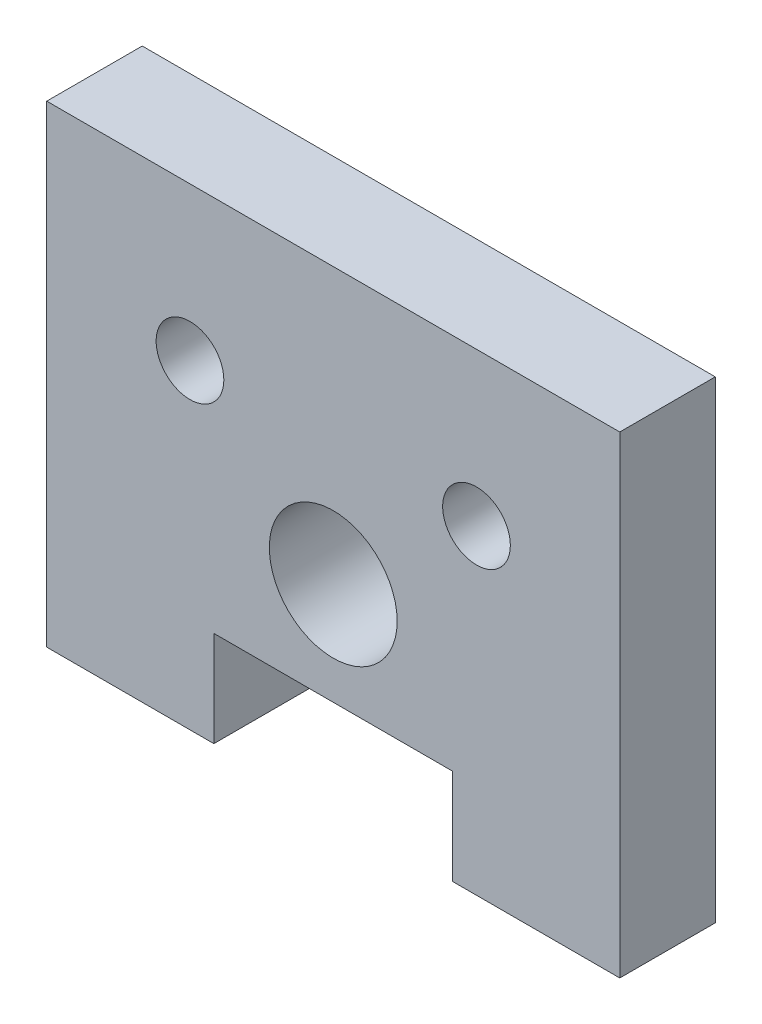
ISO-10303-21;
HEADER;
FILE_DESCRIPTION(('STEP AP214'),'2;1');
FILE_NAME('part.step','',(''),(''),'','','');
FILE_SCHEMA(('AUTOMOTIVE_DESIGN { 1 0 10303 214 1 1 1 1 }'));
ENDSEC;
DATA;
#1=APPLICATION_CONTEXT('core data for automotive mechanical design processes');
#2=APPLICATION_PROTOCOL_DEFINITION('international standard','automotive_design',2000,#1);
#3=PRODUCT_CONTEXT('',#1,'mechanical');
#4=PRODUCT('Part','Part','',(#3));
#5=PRODUCT_RELATED_PRODUCT_CATEGORY('part','',(#4));
#6=PRODUCT_DEFINITION_FORMATION('','',#4);
#7=PRODUCT_DEFINITION_CONTEXT('part definition',#1,'design');
#8=PRODUCT_DEFINITION('design','',#6,#7);
#9=PRODUCT_DEFINITION_SHAPE('','',#8);
#10=(LENGTH_UNIT() NAMED_UNIT(*) SI_UNIT(.MILLI.,.METRE.));
#11=(NAMED_UNIT(*) PLANE_ANGLE_UNIT() SI_UNIT($,.RADIAN.));
#12=(NAMED_UNIT(*) SI_UNIT($,.STERADIAN.) SOLID_ANGLE_UNIT());
#13=UNCERTAINTY_MEASURE_WITH_UNIT(LENGTH_MEASURE(1.E-05),#10,'distance_accuracy_value','');
#14=(GEOMETRIC_REPRESENTATION_CONTEXT(3) GLOBAL_UNCERTAINTY_ASSIGNED_CONTEXT((#13)) GLOBAL_UNIT_ASSIGNED_CONTEXT((#10,
#11,#12)) REPRESENTATION_CONTEXT('',''));
#15=CARTESIAN_POINT('',(0.,0.,0.));
#16=DIRECTION('',(0.,0.,1.));
#17=DIRECTION('',(1.,0.,0.));
#18=AXIS2_PLACEMENT_3D('',#15,#16,#17);
#19=CARTESIAN_POINT('',(-15.875,0.,12.7));
#20=DIRECTION('',(-1.,0.,0.));
#21=DIRECTION('',(0.,0.,1.));
#22=AXIS2_PLACEMENT_3D('',#19,#20,#21);
#23=PLANE('',#22);
#24=DIRECTION('',(0.,1.,0.));
#25=VECTOR('',#24,1.);
#26=CARTESIAN_POINT('',(-15.875,0.,0.));
#27=LINE('',#26,#25);
#28=CARTESIAN_POINT('',(-15.875,-34.544,0.));
#29=VERTEX_POINT('',#28);
#30=CARTESIAN_POINT('',(-15.875,-21.844,0.));
#31=VERTEX_POINT('',#30);
#32=EDGE_CURVE('E142',#29,#31,#27,.T.);
#33=ORIENTED_EDGE('',*,*,#32,.T.);
#34=DIRECTION('',(0.,0.,-1.));
#35=VECTOR('',#34,1.);
#36=CARTESIAN_POINT('',(-15.875,-21.844,12.7));
#37=LINE('',#36,#35);
#38=CARTESIAN_POINT('',(-15.875,-21.844,12.7));
#39=VERTEX_POINT('',#38);
#40=EDGE_CURVE('E11',#39,#31,#37,.T.);
#41=ORIENTED_EDGE('',*,*,#40,.F.);
#42=DIRECTION('',(0.,1.,0.));
#43=VECTOR('',#42,1.);
#44=CARTESIAN_POINT('',(-15.875,0.,12.7));
#45=LINE('',#44,#43);
#46=CARTESIAN_POINT('',(-15.875,-34.544,12.7));
#47=VERTEX_POINT('',#46);
#48=EDGE_CURVE('E187',#47,#39,#45,.T.);
#49=ORIENTED_EDGE('',*,*,#48,.F.);
#50=DIRECTION('',(0.,0.,-1.));
#51=VECTOR('',#50,1.);
#52=CARTESIAN_POINT('',(-15.875,-34.544,12.7));
#53=LINE('',#52,#51);
#54=EDGE_CURVE('E52',#47,#29,#53,.T.);
#55=ORIENTED_EDGE('',*,*,#54,.T.);
#56=EDGE_LOOP('',(#33,#41,#49,#55));
#57=FACE_BOUND('',#56,.T.);
#58=ADVANCED_FACE('F35',(#57),#23,.F.);
#59=CARTESIAN_POINT('',(0.,-21.844,12.7));
#60=DIRECTION('',(0.,1.,0.));
#61=DIRECTION('',(-1.,0.,0.));
#62=AXIS2_PLACEMENT_3D('',#59,#60,#61);
#63=PLANE('',#62);
#64=DIRECTION('',(1.,0.,0.));
#65=VECTOR('',#64,1.);
#66=CARTESIAN_POINT('',(0.,-21.844,0.));
#67=LINE('',#66,#65);
#68=CARTESIAN_POINT('',(15.875,-21.844,0.));
#69=VERTEX_POINT('',#68);
#70=EDGE_CURVE('E144',#31,#69,#67,.T.);
#71=ORIENTED_EDGE('',*,*,#70,.T.);
#72=DIRECTION('',(0.,0.,-1.));
#73=VECTOR('',#72,1.);
#74=CARTESIAN_POINT('',(15.875,-21.844,12.7));
#75=LINE('',#74,#73);
#76=CARTESIAN_POINT('',(15.875,-21.844,12.7));
#77=VERTEX_POINT('',#76);
#78=EDGE_CURVE('E44',#77,#69,#75,.T.);
#79=ORIENTED_EDGE('',*,*,#78,.F.);
#80=DIRECTION('',(1.,0.,0.));
#81=VECTOR('',#80,1.);
#82=CARTESIAN_POINT('',(0.,-21.844,12.7));
#83=LINE('',#82,#81);
#84=EDGE_CURVE('E90',#39,#77,#83,.T.);
#85=ORIENTED_EDGE('',*,*,#84,.F.);
#86=ORIENTED_EDGE('',*,*,#40,.T.);
#87=EDGE_LOOP('',(#71,#79,#85,#86));
#88=FACE_BOUND('',#87,.T.);
#89=ADVANCED_FACE('F223',(#88),#63,.F.);
#90=CARTESIAN_POINT('',(15.875,0.,12.7));
#91=DIRECTION('',(1.,0.,0.));
#92=DIRECTION('',(0.,0.,-1.));
#93=AXIS2_PLACEMENT_3D('',#90,#91,#92);
#94=PLANE('',#93);
#95=DIRECTION('',(0.,-1.,0.));
#96=VECTOR('',#95,1.);
#97=CARTESIAN_POINT('',(15.875,0.,0.));
#98=LINE('',#97,#96);
#99=CARTESIAN_POINT('',(15.875,-34.544,0.));
#100=VERTEX_POINT('',#99);
#101=EDGE_CURVE('E146',#69,#100,#98,.T.);
#102=ORIENTED_EDGE('',*,*,#101,.T.);
#103=DIRECTION('',(0.,0.,-1.));
#104=VECTOR('',#103,1.);
#105=CARTESIAN_POINT('',(15.875,-34.544,12.7));
#106=LINE('',#105,#104);
#107=CARTESIAN_POINT('',(15.875,-34.544,12.7));
#108=VERTEX_POINT('',#107);
#109=EDGE_CURVE('E167',#108,#100,#106,.T.);
#110=ORIENTED_EDGE('',*,*,#109,.F.);
#111=DIRECTION('',(0.,-1.,0.));
#112=VECTOR('',#111,1.);
#113=CARTESIAN_POINT('',(15.875,0.,12.7));
#114=LINE('',#113,#112);
#115=EDGE_CURVE('E174',#77,#108,#114,.T.);
#116=ORIENTED_EDGE('',*,*,#115,.F.);
#117=ORIENTED_EDGE('',*,*,#78,.T.);
#118=EDGE_LOOP('',(#102,#110,#116,#117));
#119=FACE_BOUND('',#118,.T.);
#120=ADVANCED_FACE('F172',(#119),#94,.F.);
#121=CARTESIAN_POINT('',(0.,-34.544,12.7));
#122=DIRECTION('',(0.,-1.,0.));
#123=DIRECTION('',(0.,0.,-1.));
#124=AXIS2_PLACEMENT_3D('',#121,#122,#123);
#125=PLANE('',#124);
#126=DIRECTION('',(-1.,0.,0.));
#127=VECTOR('',#126,1.);
#128=CARTESIAN_POINT('',(0.,-34.544,0.));
#129=LINE('',#128,#127);
#130=CARTESIAN_POINT('',(38.1,-34.544,0.));
#131=VERTEX_POINT('',#130);
#132=EDGE_CURVE('E149',#131,#100,#129,.T.);
#133=ORIENTED_EDGE('',*,*,#132,.F.);
#134=DIRECTION('',(0.,0.,-1.));
#135=VECTOR('',#134,1.);
#136=CARTESIAN_POINT('',(38.1,-34.544,12.7));
#137=LINE('',#136,#135);
#138=CARTESIAN_POINT('',(38.1,-34.544,12.7));
#139=VERTEX_POINT('',#138);
#140=EDGE_CURVE('E165',#139,#131,#137,.T.);
#141=ORIENTED_EDGE('',*,*,#140,.F.);
#142=DIRECTION('',(-1.,0.,0.));
#143=VECTOR('',#142,1.);
#144=CARTESIAN_POINT('',(0.,-34.544,12.7));
#145=LINE('',#144,#143);
#146=EDGE_CURVE('E182',#139,#108,#145,.T.);
#147=ORIENTED_EDGE('',*,*,#146,.T.);
#148=ORIENTED_EDGE('',*,*,#109,.T.);
#149=EDGE_LOOP('',(#133,#141,#147,#148));
#150=FACE_BOUND('',#149,.T.);
#151=ADVANCED_FACE('F180',(#150),#125,.T.);
#152=CARTESIAN_POINT('',(38.1,0.,12.7));
#153=DIRECTION('',(-1.,0.,0.));
#154=DIRECTION('',(0.,0.,1.));
#155=AXIS2_PLACEMENT_3D('',#152,#153,#154);
#156=PLANE('',#155);
#157=DIRECTION('',(0.,1.,0.));
#158=VECTOR('',#157,1.);
#159=CARTESIAN_POINT('',(38.1,0.,0.));
#160=LINE('',#159,#158);
#161=CARTESIAN_POINT('',(38.1,28.3363680824292,0.));
#162=VERTEX_POINT('',#161);
#163=EDGE_CURVE('E152',#131,#162,#160,.T.);
#164=ORIENTED_EDGE('',*,*,#163,.T.);
#165=DIRECTION('',(0.,0.,-1.));
#166=VECTOR('',#165,1.);
#167=CARTESIAN_POINT('',(38.1,28.3363680824292,12.7));
#168=LINE('',#167,#166);
#169=CARTESIAN_POINT('',(38.1,28.3363680824292,12.7));
#170=VERTEX_POINT('',#169);
#171=EDGE_CURVE('E115',#170,#162,#168,.T.);
#172=ORIENTED_EDGE('',*,*,#171,.F.);
#173=DIRECTION('',(0.,1.,0.));
#174=VECTOR('',#173,1.);
#175=CARTESIAN_POINT('',(38.1,0.,12.7));
#176=LINE('',#175,#174);
#177=EDGE_CURVE('E124',#139,#170,#176,.T.);
#178=ORIENTED_EDGE('',*,*,#177,.F.);
#179=ORIENTED_EDGE('',*,*,#140,.T.);
#180=EDGE_LOOP('',(#164,#172,#178,#179));
#181=FACE_BOUND('',#180,.T.);
#182=ADVANCED_FACE('F247',(#181),#156,.F.);
#183=CARTESIAN_POINT('',(0.,28.3363680824292,12.7));
#184=DIRECTION('',(0.,1.,0.));
#185=DIRECTION('',(-1.,0.,0.));
#186=AXIS2_PLACEMENT_3D('',#183,#184,#185);
#187=PLANE('',#186);
#188=DIRECTION('',(1.,0.,0.));
#189=VECTOR('',#188,1.);
#190=CARTESIAN_POINT('',(0.,28.3363680824292,0.));
#191=LINE('',#190,#189);
#192=CARTESIAN_POINT('',(-38.1,28.3363680824292,0.));
#193=VERTEX_POINT('',#192);
#194=EDGE_CURVE('E111',#193,#162,#191,.T.);
#195=ORIENTED_EDGE('',*,*,#194,.F.);
#196=DIRECTION('',(0.,0.,-1.));
#197=VECTOR('',#196,1.);
#198=CARTESIAN_POINT('',(-38.1,28.3363680824292,12.7));
#199=LINE('',#198,#197);
#200=CARTESIAN_POINT('',(-38.1,28.3363680824292,12.7));
#201=VERTEX_POINT('',#200);
#202=EDGE_CURVE('E106',#201,#193,#199,.T.);
#203=ORIENTED_EDGE('',*,*,#202,.F.);
#204=DIRECTION('',(1.,0.,0.));
#205=VECTOR('',#204,1.);
#206=CARTESIAN_POINT('',(0.,28.3363680824292,12.7));
#207=LINE('',#206,#205);
#208=EDGE_CURVE('E109',#201,#170,#207,.T.);
#209=ORIENTED_EDGE('',*,*,#208,.T.);
#210=ORIENTED_EDGE('',*,*,#171,.T.);
#211=EDGE_LOOP('',(#195,#203,#209,#210));
#212=FACE_BOUND('',#211,.T.);
#213=ADVANCED_FACE('F108',(#212),#187,.T.);
#214=CARTESIAN_POINT('',(-38.1,0.,12.7));
#215=DIRECTION('',(-1.,0.,0.));
#216=DIRECTION('',(0.,0.,1.));
#217=AXIS2_PLACEMENT_3D('',#214,#215,#216);
#218=PLANE('',#217);
#219=DIRECTION('',(0.,1.,0.));
#220=VECTOR('',#219,1.);
#221=CARTESIAN_POINT('',(-38.1,0.,0.));
#222=LINE('',#221,#220);
#223=CARTESIAN_POINT('',(-38.1,-34.544,0.));
#224=VERTEX_POINT('',#223);
#225=EDGE_CURVE('E156',#224,#193,#222,.T.);
#226=ORIENTED_EDGE('',*,*,#225,.F.);
#227=DIRECTION('',(0.,0.,-1.));
#228=VECTOR('',#227,1.);
#229=CARTESIAN_POINT('',(-38.1,-34.544,12.7));
#230=LINE('',#229,#228);
#231=CARTESIAN_POINT('',(-38.1,-34.544,12.7));
#232=VERTEX_POINT('',#231);
#233=EDGE_CURVE('E78',#232,#224,#230,.T.);
#234=ORIENTED_EDGE('',*,*,#233,.F.);
#235=DIRECTION('',(0.,1.,0.));
#236=VECTOR('',#235,1.);
#237=CARTESIAN_POINT('',(-38.1,0.,12.7));
#238=LINE('',#237,#236);
#239=EDGE_CURVE('E121',#232,#201,#238,.T.);
#240=ORIENTED_EDGE('',*,*,#239,.T.);
#241=ORIENTED_EDGE('',*,*,#202,.T.);
#242=EDGE_LOOP('',(#226,#234,#240,#241));
#243=FACE_BOUND('',#242,.T.);
#244=ADVANCED_FACE('F127',(#243),#218,.T.);
#245=CARTESIAN_POINT('',(-19.05,7.99200000000001,12.7));
#246=DIRECTION('',(0.,0.,-1.));
#247=DIRECTION('',(-1.,0.,0.));
#248=AXIS2_PLACEMENT_3D('',#245,#246,#247);
#249=CYLINDRICAL_SURFACE('',#248,4.5);
#250=CARTESIAN_POINT('',(-19.05,7.99200000000001,12.7));
#251=DIRECTION('',(0.,0.,1.));
#252=DIRECTION('',(1.,0.,0.));
#253=AXIS2_PLACEMENT_3D('',#250,#251,#252);
#254=CIRCLE('',#253,4.5);
#255=CARTESIAN_POINT('',(-14.55,7.99200000000001,12.7));
#256=VERTEX_POINT('',#255);
#257=EDGE_CURVE('E189',#256,#256,#254,.T.);
#258=ORIENTED_EDGE('',*,*,#257,.T.);
#259=EDGE_LOOP('',(#258));
#260=FACE_BOUND('',#259,.T.);
#261=CARTESIAN_POINT('',(-19.05,7.99200000000001,0.));
#262=DIRECTION('',(0.,0.,1.));
#263=DIRECTION('',(1.,0.,0.));
#264=AXIS2_PLACEMENT_3D('',#261,#262,#263);
#265=CIRCLE('',#264,4.5);
#266=CARTESIAN_POINT('',(-14.55,7.99200000000001,0.));
#267=VERTEX_POINT('',#266);
#268=EDGE_CURVE('E139',#267,#267,#265,.T.);
#269=ORIENTED_EDGE('',*,*,#268,.F.);
#270=EDGE_LOOP('',(#269));
#271=FACE_BOUND('',#270,.T.);
#272=ADVANCED_FACE('F208',(#260,#271),#249,.F.);
#273=CARTESIAN_POINT('',(19.05,7.99200000000001,12.7));
#274=DIRECTION('',(0.,0.,-1.));
#275=DIRECTION('',(-1.,0.,0.));
#276=AXIS2_PLACEMENT_3D('',#273,#274,#275);
#277=CYLINDRICAL_SURFACE('',#276,4.5);
#278=CARTESIAN_POINT('',(19.05,7.99200000000001,12.7));
#279=DIRECTION('',(0.,0.,1.));
#280=DIRECTION('',(1.,0.,0.));
#281=AXIS2_PLACEMENT_3D('',#278,#279,#280);
#282=CIRCLE('',#281,4.5);
#283=CARTESIAN_POINT('',(23.55,7.99200000000001,12.7));
#284=VERTEX_POINT('',#283);
#285=EDGE_CURVE('E192',#284,#284,#282,.T.);
#286=ORIENTED_EDGE('',*,*,#285,.T.);
#287=EDGE_LOOP('',(#286));
#288=FACE_BOUND('',#287,.T.);
#289=CARTESIAN_POINT('',(19.05,7.99200000000001,0.));
#290=DIRECTION('',(0.,0.,1.));
#291=DIRECTION('',(1.,0.,0.));
#292=AXIS2_PLACEMENT_3D('',#289,#290,#291);
#293=CIRCLE('',#292,4.5);
#294=CARTESIAN_POINT('',(23.55,7.99200000000001,0.));
#295=VERTEX_POINT('',#294);
#296=EDGE_CURVE('E136',#295,#295,#293,.T.);
#297=ORIENTED_EDGE('',*,*,#296,.F.);
#298=EDGE_LOOP('',(#297));
#299=FACE_BOUND('',#298,.T.);
#300=ADVANCED_FACE('F211',(#288,#299),#277,.F.);
#301=CARTESIAN_POINT('',(0.,-8.26399999999999,12.7));
#302=DIRECTION('',(0.,0.,-1.));
#303=DIRECTION('',(-1.,0.,0.));
#304=AXIS2_PLACEMENT_3D('',#301,#302,#303);
#305=CYLINDRICAL_SURFACE('',#304,8.5);
#306=CARTESIAN_POINT('',(0.,-8.26399999999999,12.7));
#307=DIRECTION('',(0.,0.,1.));
#308=DIRECTION('',(1.,0.,0.));
#309=AXIS2_PLACEMENT_3D('',#306,#307,#308);
#310=CIRCLE('',#309,8.5);
#311=CARTESIAN_POINT('',(8.5,-8.26399999999999,12.7));
#312=VERTEX_POINT('',#311);
#313=EDGE_CURVE('E161',#312,#312,#310,.T.);
#314=ORIENTED_EDGE('',*,*,#313,.T.);
#315=EDGE_LOOP('',(#314));
#316=FACE_BOUND('',#315,.T.);
#317=CARTESIAN_POINT('',(0.,-8.26399999999999,0.));
#318=DIRECTION('',(0.,0.,1.));
#319=DIRECTION('',(1.,0.,0.));
#320=AXIS2_PLACEMENT_3D('',#317,#318,#319);
#321=CIRCLE('',#320,8.5);
#322=CARTESIAN_POINT('',(8.5,-8.26399999999999,0.));
#323=VERTEX_POINT('',#322);
#324=EDGE_CURVE('E133',#323,#323,#321,.T.);
#325=ORIENTED_EDGE('',*,*,#324,.F.);
#326=EDGE_LOOP('',(#325));
#327=FACE_BOUND('',#326,.T.);
#328=ADVANCED_FACE('F37',(#316,#327),#305,.F.);
#329=CARTESIAN_POINT('',(0.,-34.544,12.7));
#330=DIRECTION('',(0.,-1.,0.));
#331=DIRECTION('',(0.,0.,-1.));
#332=AXIS2_PLACEMENT_3D('',#329,#330,#331);
#333=PLANE('',#332);
#334=DIRECTION('',(-1.,0.,0.));
#335=VECTOR('',#334,1.);
#336=CARTESIAN_POINT('',(0.,-34.544,0.));
#337=LINE('',#336,#335);
#338=EDGE_CURVE('E158',#29,#224,#337,.T.);
#339=ORIENTED_EDGE('',*,*,#338,.F.);
#340=ORIENTED_EDGE('',*,*,#54,.F.);
#341=DIRECTION('',(-1.,0.,0.));
#342=VECTOR('',#341,1.);
#343=CARTESIAN_POINT('',(0.,-34.544,12.7));
#344=LINE('',#343,#342);
#345=EDGE_CURVE('E128',#47,#232,#344,.T.);
#346=ORIENTED_EDGE('',*,*,#345,.T.);
#347=ORIENTED_EDGE('',*,*,#233,.T.);
#348=EDGE_LOOP('',(#339,#340,#346,#347));
#349=FACE_BOUND('',#348,.T.);
#350=ADVANCED_FACE('F202',(#349),#333,.T.);
#351=CARTESIAN_POINT('',(0.,0.,12.7));
#352=DIRECTION('',(0.,0.,1.));
#353=DIRECTION('',(1.,0.,0.));
#354=AXIS2_PLACEMENT_3D('',#351,#352,#353);
#355=PLANE('',#354);
#356=ORIENTED_EDGE('',*,*,#313,.F.);
#357=EDGE_LOOP('',(#356));
#358=FACE_BOUND('',#357,.T.);
#359=ORIENTED_EDGE('',*,*,#285,.F.);
#360=EDGE_LOOP('',(#359));
#361=FACE_BOUND('',#360,.T.);
#362=ORIENTED_EDGE('',*,*,#257,.F.);
#363=EDGE_LOOP('',(#362));
#364=FACE_BOUND('',#363,.T.);
#365=ORIENTED_EDGE('',*,*,#48,.T.);
#366=ORIENTED_EDGE('',*,*,#84,.T.);
#367=ORIENTED_EDGE('',*,*,#115,.T.);
#368=ORIENTED_EDGE('',*,*,#146,.F.);
#369=ORIENTED_EDGE('',*,*,#177,.T.);
#370=ORIENTED_EDGE('',*,*,#208,.F.);
#371=ORIENTED_EDGE('',*,*,#239,.F.);
#372=ORIENTED_EDGE('',*,*,#345,.F.);
#373=EDGE_LOOP('',(#365,#366,#367,#368,#369,#370,#371,#372));
#374=FACE_BOUND('',#373,.T.);
#375=ADVANCED_FACE('F119',(#358,#361,#364,#374),#355,.T.);
#376=CARTESIAN_POINT('',(0.,0.,0.));
#377=DIRECTION('',(0.,0.,1.));
#378=DIRECTION('',(1.,0.,0.));
#379=AXIS2_PLACEMENT_3D('',#376,#377,#378);
#380=PLANE('',#379);
#381=ORIENTED_EDGE('',*,*,#324,.T.);
#382=EDGE_LOOP('',(#381));
#383=FACE_BOUND('',#382,.T.);
#384=ORIENTED_EDGE('',*,*,#296,.T.);
#385=EDGE_LOOP('',(#384));
#386=FACE_BOUND('',#385,.T.);
#387=ORIENTED_EDGE('',*,*,#268,.T.);
#388=EDGE_LOOP('',(#387));
#389=FACE_BOUND('',#388,.T.);
#390=ORIENTED_EDGE('',*,*,#32,.F.);
#391=ORIENTED_EDGE('',*,*,#338,.T.);
#392=ORIENTED_EDGE('',*,*,#225,.T.);
#393=ORIENTED_EDGE('',*,*,#194,.T.);
#394=ORIENTED_EDGE('',*,*,#163,.F.);
#395=ORIENTED_EDGE('',*,*,#132,.T.);
#396=ORIENTED_EDGE('',*,*,#101,.F.);
#397=ORIENTED_EDGE('',*,*,#70,.F.);
#398=EDGE_LOOP('',(#390,#391,#392,#393,#394,#395,#396,#397));
#399=FACE_BOUND('',#398,.T.);
#400=ADVANCED_FACE('F176',(#383,#386,#389,#399),#380,.F.);
#401=CLOSED_SHELL('',(#58,#89,#120,#151,#182,#213,#244,#272,#300,#328,#350,#375,#400));
#402=MANIFOLD_SOLID_BREP('B2',#401);
#403=ADVANCED_BREP_SHAPE_REPRESENTATION('',(#18,#402),#14);
#404=SHAPE_DEFINITION_REPRESENTATION(#9,#403);
ENDSEC;
END-ISO-10303-21;
